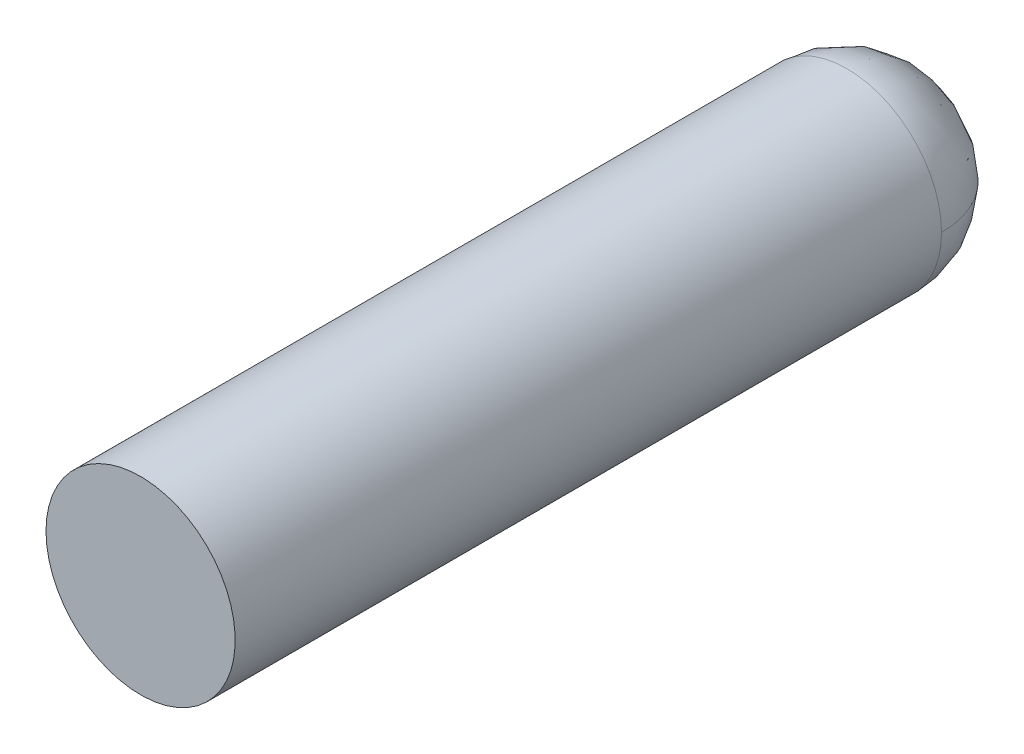
ISO-10303-21;
HEADER;
FILE_DESCRIPTION(('STEP AP214'),'2;1');
FILE_NAME('part.step','',(''),(''),'','','');
FILE_SCHEMA(('AUTOMOTIVE_DESIGN { 1 0 10303 214 1 1 1 1 }'));
ENDSEC;
DATA;
#1=APPLICATION_CONTEXT('core data for automotive mechanical design processes');
#2=APPLICATION_PROTOCOL_DEFINITION('international standard','automotive_design',2000,#1);
#3=PRODUCT_CONTEXT('',#1,'mechanical');
#4=PRODUCT('Part','Part','',(#3));
#5=PRODUCT_RELATED_PRODUCT_CATEGORY('part','',(#4));
#6=PRODUCT_DEFINITION_FORMATION('','',#4);
#7=PRODUCT_DEFINITION_CONTEXT('part definition',#1,'design');
#8=PRODUCT_DEFINITION('design','',#6,#7);
#9=PRODUCT_DEFINITION_SHAPE('','',#8);
#10=(LENGTH_UNIT() NAMED_UNIT(*) SI_UNIT(.MILLI.,.METRE.));
#11=(NAMED_UNIT(*) PLANE_ANGLE_UNIT() SI_UNIT($,.RADIAN.));
#12=(NAMED_UNIT(*) SI_UNIT($,.STERADIAN.) SOLID_ANGLE_UNIT());
#13=UNCERTAINTY_MEASURE_WITH_UNIT(LENGTH_MEASURE(1.E-05),#10,'distance_accuracy_value','');
#14=(GEOMETRIC_REPRESENTATION_CONTEXT(3) GLOBAL_UNCERTAINTY_ASSIGNED_CONTEXT((#13)) GLOBAL_UNIT_ASSIGNED_CONTEXT((#10,
#11,#12)) REPRESENTATION_CONTEXT('',''));
#15=CARTESIAN_POINT('',(0.,0.,0.));
#16=DIRECTION('',(0.,0.,1.));
#17=DIRECTION('',(1.,0.,0.));
#18=AXIS2_PLACEMENT_3D('',#15,#16,#17);
#19=CARTESIAN_POINT('',(-0.15,0.,-1.11));
#20=CARTESIAN_POINT('',(-0.15,-0.3,-1.11));
#21=CARTESIAN_POINT('',(0.15,-0.3,-1.11));
#22=CARTESIAN_POINT('',(0.15,0.,-1.11));
#23=CARTESIAN_POINT('',(-0.15,0.,-1.146651914292));
#24=CARTESIAN_POINT('',(-0.15,-0.3,-1.146651914292));
#25=CARTESIAN_POINT('',(0.15,-0.3,-1.146651914292));
#26=CARTESIAN_POINT('',(0.15,0.,-1.146651914292));
#27=CARTESIAN_POINT('',(-0.138488123957,0.,-1.183300710099));
#28=CARTESIAN_POINT('',(-0.138488123957,-0.276976247914,-1.183300710099));
#29=CARTESIAN_POINT('',(0.138488123957,-0.276976247914,-1.183300710099));
#30=CARTESIAN_POINT('',(0.138488123957,0.,-1.183300710099));
#31=CARTESIAN_POINT('',(-0.11544662095,0.,-1.21544662095));
#32=CARTESIAN_POINT('',(-0.11544662095,-0.2308932419,-1.21544662095));
#33=CARTESIAN_POINT('',(0.11544662095,-0.2308932419,-1.21544662095));
#34=CARTESIAN_POINT('',(0.11544662095,0.,-1.21544662095));
#35=CARTESIAN_POINT('',(-0.08330071009872,0.,-1.238488123957));
#36=CARTESIAN_POINT('',(-0.08330071009872,-0.16660142019744,-1.238488123957));
#37=CARTESIAN_POINT('',(0.0833007100987201,-0.16660142019744,-1.238488123957));
#38=CARTESIAN_POINT('',(0.08330071009872,0.,-1.238488123957));
#39=CARTESIAN_POINT('',(-0.04665191429188,0.,-1.25));
#40=CARTESIAN_POINT('',(-0.04665191429188,-0.0933038285837601,-1.25));
#41=CARTESIAN_POINT('',(0.04665191429188,-0.09330382858376,-1.25));
#42=CARTESIAN_POINT('',(0.04665191429188,0.,-1.25));
#43=CARTESIAN_POINT('',(-0.009999999999999,0.,-1.25));
#44=CARTESIAN_POINT('',(-0.009999999999999,-0.019999999999998,-1.25));
#45=CARTESIAN_POINT('',(0.00999999999999901,-0.019999999999998,-1.25));
#46=CARTESIAN_POINT('',(0.009999999999999,0.,-1.25));
#47=(BOUNDED_SURFACE() B_SPLINE_SURFACE(6,3,((#19,#20,#21,#22),(#23,#24,#25,#26),(#27,#28,#29,
#30),(#31,#32,#33,#34),(#35,#36,#37,#38),(#39,#40,#41,#42),(#43,#44,#45,#46)),.UNSPECIFIED.,.F.,
.F.,.F.) B_SPLINE_SURFACE_WITH_KNOTS((7,7),(4,4),(0.,1.570796326795),(0.,1.),
.UNSPECIFIED.) GEOMETRIC_REPRESENTATION_ITEM() RATIONAL_B_SPLINE_SURFACE(((1.,0.333333333333333,
0.333333333333333,1.),(1.,0.333333333333333,0.333333333333333,1.),(1.,0.333333333333333,
0.333333333333333,1.),(1.,0.333333333333333,0.333333333333333,1.),(1.,0.333333333333333,
0.333333333333333,1.),(1.,0.333333333333333,0.333333333333333,1.),(1.,0.333333333333333,
0.333333333333333,1.))) REPRESENTATION_ITEM('') SURFACE());
#48=CARTESIAN_POINT('',(-0.15,0.,-1.11));
#49=CARTESIAN_POINT('',(-0.15,0.,-1.146651914292));
#50=CARTESIAN_POINT('',(-0.138488123957,0.,-1.183300710099));
#51=CARTESIAN_POINT('',(-0.11544662095,0.,-1.21544662095));
#52=CARTESIAN_POINT('',(-0.08330071009872,0.,-1.238488123957));
#53=CARTESIAN_POINT('',(-0.04665191429188,0.,-1.25));
#54=CARTESIAN_POINT('',(-0.009999999999999,0.,-1.25));
#55=B_SPLINE_CURVE_WITH_KNOTS('',6,(#48,#49,#50,#51,#52,#53,#54),.UNSPECIFIED.,.F.,.F.,(7,7),
(0.,1.570796326795),.UNSPECIFIED.);
#56=CARTESIAN_POINT('',(0.,0.,-1.25));
#57=VERTEX_POINT('',#56);
#58=CARTESIAN_POINT('',(-0.15,0.,-1.11));
#59=VERTEX_POINT('',#58);
#60=EDGE_CURVE('E37',#57,#59,#55,.F.);
#61=CARTESIAN_POINT('',(0.15,0.,-1.11));
#62=CARTESIAN_POINT('',(0.15,0.,-1.146651914292));
#63=CARTESIAN_POINT('',(0.138488123957,0.,-1.183300710099));
#64=CARTESIAN_POINT('',(0.11544662095,0.,-1.21544662095));
#65=CARTESIAN_POINT('',(0.08330071009872,0.,-1.238488123957));
#66=CARTESIAN_POINT('',(0.04665191429188,0.,-1.25));
#67=CARTESIAN_POINT('',(0.009999999999999,0.,-1.25));
#68=B_SPLINE_CURVE_WITH_KNOTS('',6,(#61,#62,#63,#64,#65,#66,#67),.UNSPECIFIED.,.F.,.F.,(7,7),
(0.,1.570796326795),.UNSPECIFIED.);
#69=CARTESIAN_POINT('',(0.15,0.,-1.11));
#70=VERTEX_POINT('',#69);
#71=EDGE_CURVE('E39',#70,#57,#68,.T.);
#72=CARTESIAN_POINT('',(0.,0.,-1.11));
#73=DIRECTION('',(0.,0.,-1.));
#74=DIRECTION('',(-1.,0.,0.));
#75=AXIS2_PLACEMENT_3D('',#72,#73,#74);
#76=CIRCLE('',#75,0.15);
#77=EDGE_CURVE('E34',#59,#70,#76,.F.);
#78=CARTESIAN_POINT('',(-0.15,0.,-1.11));
#79=CARTESIAN_POINT('',(-0.15,-0.3,-1.11));
#80=CARTESIAN_POINT('',(0.15,-0.3,-1.11));
#81=CARTESIAN_POINT('',(0.15,0.,-1.11));
#82=CARTESIAN_POINT('',(-0.15,0.,-1.146651914292));
#83=CARTESIAN_POINT('',(-0.15,-0.3,-1.146651914292));
#84=CARTESIAN_POINT('',(0.15,-0.3,-1.146651914292));
#85=CARTESIAN_POINT('',(0.15,0.,-1.146651914292));
#86=CARTESIAN_POINT('',(-0.138488123957,0.,-1.183300710099));
#87=CARTESIAN_POINT('',(-0.138488123957,-0.276976247914,-1.183300710099));
#88=CARTESIAN_POINT('',(0.138488123957,-0.276976247914,-1.183300710099));
#89=CARTESIAN_POINT('',(0.138488123957,0.,-1.183300710099));
#90=CARTESIAN_POINT('',(-0.11544662095,0.,-1.21544662095));
#91=CARTESIAN_POINT('',(-0.11544662095,-0.2308932419,-1.21544662095));
#92=CARTESIAN_POINT('',(0.11544662095,-0.2308932419,-1.21544662095));
#93=CARTESIAN_POINT('',(0.11544662095,0.,-1.21544662095));
#94=CARTESIAN_POINT('',(-0.08330071009872,0.,-1.238488123957));
#95=CARTESIAN_POINT('',(-0.08330071009872,-0.16660142019744,-1.238488123957));
#96=CARTESIAN_POINT('',(0.0833007100987201,-0.16660142019744,-1.238488123957));
#97=CARTESIAN_POINT('',(0.08330071009872,0.,-1.238488123957));
#98=CARTESIAN_POINT('',(-0.04665191429188,0.,-1.25));
#99=CARTESIAN_POINT('',(-0.04665191429188,-0.0933038285837601,-1.25));
#100=CARTESIAN_POINT('',(0.04665191429188,-0.09330382858376,-1.25));
#101=CARTESIAN_POINT('',(0.04665191429188,0.,-1.25));
#102=CARTESIAN_POINT('',(-0.009999999999999,0.,-1.25));
#103=CARTESIAN_POINT('',(-0.009999999999999,-0.019999999999998,-1.25));
#104=CARTESIAN_POINT('',(0.00999999999999901,-0.019999999999998,-1.25));
#105=CARTESIAN_POINT('',(0.009999999999999,0.,-1.25));
#106=CARTESIAN_POINT('',(-0.00792333333333248,0.,-1.25));
#107=CARTESIAN_POINT('',(-0.00792333333333248,-0.015846666666665,-1.25));
#108=CARTESIAN_POINT('',(0.00792333333333248,-0.015846666666665,-1.25));
#109=CARTESIAN_POINT('',(0.00792333333333248,0.,-1.25));
#110=CARTESIAN_POINT('',(-0.00584666666666595,0.,-1.25));
#111=CARTESIAN_POINT('',(-0.00584666666666595,-0.0116933333333319,-1.25));
#112=CARTESIAN_POINT('',(0.00584666666666596,-0.0116933333333319,-1.25));
#113=CARTESIAN_POINT('',(0.00584666666666595,0.,-1.25));
#114=CARTESIAN_POINT('',(-0.00376999999999943,0.,-1.25));
#115=CARTESIAN_POINT('',(-0.00376999999999943,-0.00753999999999886,-1.25));
#116=CARTESIAN_POINT('',(0.00376999999999943,-0.00753999999999886,-1.25));
#117=CARTESIAN_POINT('',(0.00376999999999943,0.,-1.25));
#118=CARTESIAN_POINT('',(-0.00169333333333291,0.,-1.25));
#119=CARTESIAN_POINT('',(-0.00169333333333291,-0.00338666666666581,-1.25));
#120=CARTESIAN_POINT('',(0.00169333333333291,-0.00338666666666581,-1.25));
#121=CARTESIAN_POINT('',(0.00169333333333291,0.,-1.25));
#122=CARTESIAN_POINT('',(0.000383333333333613,0.,-1.25));
#123=CARTESIAN_POINT('',(0.00038333333333362,0.000766666666667239,-1.25));
#124=CARTESIAN_POINT('',(-0.00038333333333362,0.000766666666667239,-1.25));
#125=CARTESIAN_POINT('',(-0.000383333333333618,0.,-1.25));
#126=CARTESIAN_POINT('',(0.00246000000000014,0.,-1.25));
#127=CARTESIAN_POINT('',(0.00246000000000014,0.00492000000000029,-1.25));
#128=CARTESIAN_POINT('',(-0.00246000000000014,0.00492000000000029,-1.25));
#129=CARTESIAN_POINT('',(-0.00246000000000014,0.,-1.25));
#130=(BOUNDED_SURFACE() B_SPLINE_SURFACE(6,3,((#78,#79,#80,#81),(#82,#83,#84,#85),(#86,#87,#88,
#89),(#90,#91,#92,#93),(#94,#95,#96,#97),(#98,#99,#100,#101),(#102,#103,#104,#105),(#106,#107,
#108,#109),(#110,#111,#112,#113),(#114,#115,#116,#117),(#118,#119,#120,#121),(#122,#123,#124,
#125),(#126,#127,#128,#129)),.UNSPECIFIED.,.F.,.F.,.F.) B_SPLINE_SURFACE_WITH_KNOTS((7,6,7),(4,
4),(0.,1.570796326795,1.659796326795),(0.,1.),
.UNSPECIFIED.) GEOMETRIC_REPRESENTATION_ITEM() RATIONAL_B_SPLINE_SURFACE(((1.,0.333333333333333,
0.333333333333333,1.),(1.,0.333333333333333,0.333333333333333,1.),(1.,0.333333333333333,
0.333333333333333,1.),(1.,0.333333333333333,0.333333333333333,1.),(1.,0.333333333333333,
0.333333333333333,1.),(1.,0.333333333333333,0.333333333333333,1.),(1.,0.333333333333333,
0.333333333333333,1.),(1.,0.333333333333333,0.333333333333333,1.),(1.,0.333333333333333,
0.333333333333333,1.),(1.,0.333333333333333,0.333333333333333,1.),(1.,0.333333333333333,
0.333333333333333,1.),(1.,0.333333333333333,0.333333333333333,1.),(1.,0.333333333333333,
0.333333333333333,1.))) REPRESENTATION_ITEM('') SURFACE());
#131=ORIENTED_EDGE('',*,*,#60,.F.);
#132=ORIENTED_EDGE('',*,*,#71,.F.);
#133=ORIENTED_EDGE('',*,*,#77,.F.);
#134=EDGE_LOOP('',(#131,#132,#133));
#135=FACE_BOUND('',#134,.T.);
#136=ADVANCED_FACE('F16',(#135),#130,.T.);
#137=CARTESIAN_POINT('',(0.,0.,0.01));
#138=DIRECTION('',(0.,0.,-1.));
#139=DIRECTION('',(-1.,0.,0.));
#140=AXIS2_PLACEMENT_3D('',#137,#138,#139);
#141=PLANE('',#140);
#142=CARTESIAN_POINT('',(0.,0.,0.01));
#143=DIRECTION('',(0.,0.,-1.));
#144=DIRECTION('',(-1.,0.,0.));
#145=AXIS2_PLACEMENT_3D('',#142,#143,#144);
#146=CIRCLE('',#145,0.15);
#147=CARTESIAN_POINT('',(-0.15,0.,0.01));
#148=VERTEX_POINT('',#147);
#149=EDGE_CURVE('E21',#148,#148,#146,.T.);
#150=ORIENTED_EDGE('',*,*,#149,.F.);
#151=EDGE_LOOP('',(#150));
#152=FACE_BOUND('',#151,.T.);
#153=ADVANCED_FACE('F69',(#152),#141,.F.);
#154=CARTESIAN_POINT('',(0.15,0.,-1.11));
#155=CARTESIAN_POINT('',(0.15,0.3,-1.11));
#156=CARTESIAN_POINT('',(-0.15,0.3,-1.11));
#157=CARTESIAN_POINT('',(-0.15,0.,-1.11));
#158=CARTESIAN_POINT('',(0.15,0.,-1.146651914292));
#159=CARTESIAN_POINT('',(0.15,0.3,-1.146651914292));
#160=CARTESIAN_POINT('',(-0.15,0.3,-1.146651914292));
#161=CARTESIAN_POINT('',(-0.15,0.,-1.146651914292));
#162=CARTESIAN_POINT('',(0.138488123957,0.,-1.183300710099));
#163=CARTESIAN_POINT('',(0.138488123957,0.276976247914,-1.183300710099));
#164=CARTESIAN_POINT('',(-0.138488123957,0.276976247914,-1.183300710099));
#165=CARTESIAN_POINT('',(-0.138488123957,0.,-1.183300710099));
#166=CARTESIAN_POINT('',(0.11544662095,0.,-1.21544662095));
#167=CARTESIAN_POINT('',(0.11544662095,0.2308932419,-1.21544662095));
#168=CARTESIAN_POINT('',(-0.11544662095,0.2308932419,-1.21544662095));
#169=CARTESIAN_POINT('',(-0.11544662095,0.,-1.21544662095));
#170=CARTESIAN_POINT('',(0.08330071009872,0.,-1.238488123957));
#171=CARTESIAN_POINT('',(0.08330071009872,0.16660142019744,-1.238488123957));
#172=CARTESIAN_POINT('',(-0.08330071009872,0.16660142019744,-1.238488123957));
#173=CARTESIAN_POINT('',(-0.08330071009872,0.,-1.238488123957));
#174=CARTESIAN_POINT('',(0.04665191429188,0.,-1.25));
#175=CARTESIAN_POINT('',(0.04665191429188,0.09330382858376,-1.25));
#176=CARTESIAN_POINT('',(-0.04665191429188,0.09330382858376,-1.25));
#177=CARTESIAN_POINT('',(-0.04665191429188,0.,-1.25));
#178=CARTESIAN_POINT('',(0.009999999999999,0.,-1.25));
#179=CARTESIAN_POINT('',(0.009999999999999,0.019999999999998,-1.25));
#180=CARTESIAN_POINT('',(-0.00999999999999899,0.019999999999998,-1.25));
#181=CARTESIAN_POINT('',(-0.009999999999999,0.,-1.25));
#182=(BOUNDED_SURFACE() B_SPLINE_SURFACE(6,3,((#154,#155,#156,#157),(#158,#159,#160,#161),(#162,
#163,#164,#165),(#166,#167,#168,#169),(#170,#171,#172,#173),(#174,#175,#176,#177),(#178,#179,
#180,#181)),.UNSPECIFIED.,.F.,.F.,.F.) B_SPLINE_SURFACE_WITH_KNOTS((7,7),(4,4),(0.,
1.570796326795),(0.,1.),
.UNSPECIFIED.) GEOMETRIC_REPRESENTATION_ITEM() RATIONAL_B_SPLINE_SURFACE(((1.,0.333333333333333,
0.333333333333333,1.),(1.,0.333333333333333,0.333333333333333,1.),(1.,0.333333333333333,
0.333333333333333,1.),(1.,0.333333333333333,0.333333333333333,1.),(1.,0.333333333333333,
0.333333333333333,1.),(1.,0.333333333333333,0.333333333333333,1.),(1.,0.333333333333333,
0.333333333333333,1.))) REPRESENTATION_ITEM('') SURFACE());
#183=CARTESIAN_POINT('',(0.,0.,-1.11));
#184=DIRECTION('',(0.,0.,-1.));
#185=DIRECTION('',(-1.,0.,0.));
#186=AXIS2_PLACEMENT_3D('',#183,#184,#185);
#187=CIRCLE('',#186,0.15);
#188=EDGE_CURVE('E11',#70,#59,#187,.F.);
#189=ORIENTED_EDGE('',*,*,#71,.T.);
#190=ORIENTED_EDGE('',*,*,#60,.T.);
#191=ORIENTED_EDGE('',*,*,#188,.F.);
#192=EDGE_LOOP('',(#189,#190,#191));
#193=FACE_BOUND('',#192,.T.);
#194=ADVANCED_FACE('F43',(#193),#182,.T.);
#195=CARTESIAN_POINT('',(0.,0.,-1.5));
#196=DIRECTION('',(0.,0.,-1.));
#197=DIRECTION('',(-1.,0.,0.));
#198=AXIS2_PLACEMENT_3D('',#195,#196,#197);
#199=CYLINDRICAL_SURFACE('',#198,0.15);
#200=ORIENTED_EDGE('',*,*,#77,.T.);
#201=ORIENTED_EDGE('',*,*,#188,.T.);
#202=EDGE_LOOP('',(#200,#201));
#203=FACE_BOUND('',#202,.T.);
#204=ORIENTED_EDGE('',*,*,#149,.T.);
#205=EDGE_LOOP('',(#204));
#206=FACE_BOUND('',#205,.T.);
#207=ADVANCED_FACE('F67',(#203,#206),#199,.T.);
#208=CLOSED_SHELL('',(#136,#153,#194,#207));
#209=MANIFOLD_SOLID_BREP('B1',#208);
#210=ADVANCED_BREP_SHAPE_REPRESENTATION('',(#18,#209),#14);
#211=SHAPE_DEFINITION_REPRESENTATION(#9,#210);
ENDSEC;
END-ISO-10303-21;
